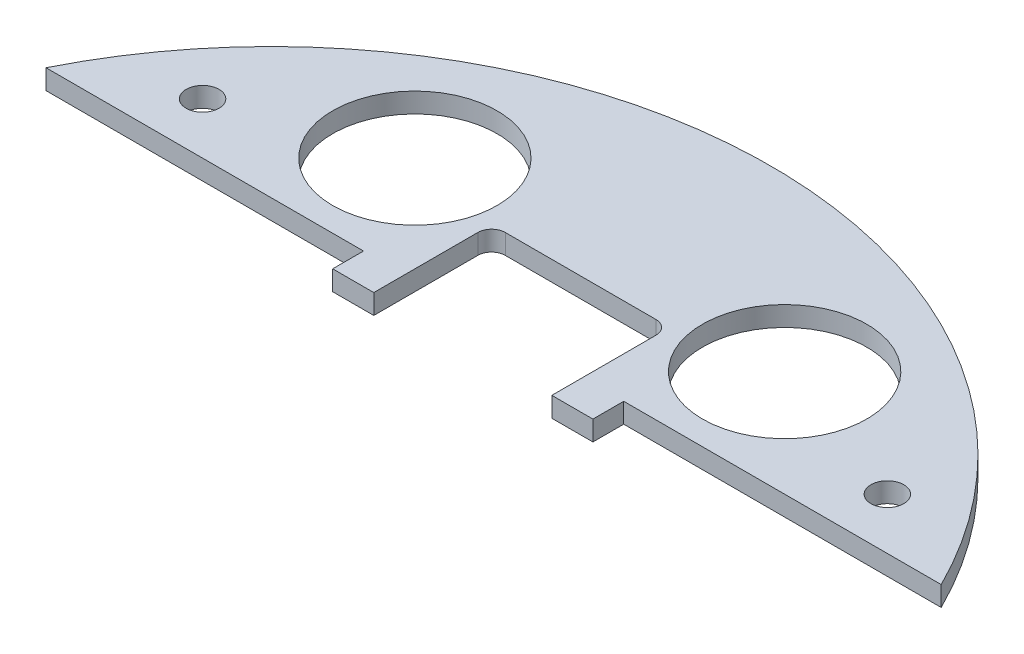
ISO-10303-21;
HEADER;
FILE_DESCRIPTION(('STEP AP214'),'2;1');
FILE_NAME('part.step','',(''),(''),'','','');
FILE_SCHEMA(('AUTOMOTIVE_DESIGN { 1 0 10303 214 1 1 1 1 }'));
ENDSEC;
DATA;
#1=APPLICATION_CONTEXT('core data for automotive mechanical design processes');
#2=APPLICATION_PROTOCOL_DEFINITION('international standard','automotive_design',2000,#1);
#3=PRODUCT_CONTEXT('',#1,'mechanical');
#4=PRODUCT('Part','Part','',(#3));
#5=PRODUCT_RELATED_PRODUCT_CATEGORY('part','',(#4));
#6=PRODUCT_DEFINITION_FORMATION('','',#4);
#7=PRODUCT_DEFINITION_CONTEXT('part definition',#1,'design');
#8=PRODUCT_DEFINITION('design','',#6,#7);
#9=PRODUCT_DEFINITION_SHAPE('','',#8);
#10=(LENGTH_UNIT() NAMED_UNIT(*) SI_UNIT(.MILLI.,.METRE.));
#11=(NAMED_UNIT(*) PLANE_ANGLE_UNIT() SI_UNIT($,.RADIAN.));
#12=(NAMED_UNIT(*) SI_UNIT($,.STERADIAN.) SOLID_ANGLE_UNIT());
#13=UNCERTAINTY_MEASURE_WITH_UNIT(LENGTH_MEASURE(1.E-05),#10,'distance_accuracy_value','');
#14=(GEOMETRIC_REPRESENTATION_CONTEXT(3) GLOBAL_UNCERTAINTY_ASSIGNED_CONTEXT((#13)) GLOBAL_UNIT_ASSIGNED_CONTEXT((#10,
#11,#12)) REPRESENTATION_CONTEXT('',''));
#15=CARTESIAN_POINT('',(0.,0.,0.));
#16=DIRECTION('',(0.,0.,1.));
#17=DIRECTION('',(1.,0.,0.));
#18=AXIS2_PLACEMENT_3D('',#15,#16,#17);
#19=CARTESIAN_POINT('',(-27.,0.,-48.));
#20=DIRECTION('',(0.,1.,0.));
#21=DIRECTION('',(0.,0.,1.));
#22=AXIS2_PLACEMENT_3D('',#19,#20,#21);
#23=CYLINDRICAL_SURFACE('',#22,12.);
#24=CARTESIAN_POINT('',(-27.,0.,-48.));
#25=DIRECTION('',(0.,1.,0.));
#26=DIRECTION('',(0.,0.,1.));
#27=AXIS2_PLACEMENT_3D('',#24,#25,#26);
#28=CIRCLE('',#27,12.);
#29=CARTESIAN_POINT('',(-27.,0.,-36.));
#30=VERTEX_POINT('',#29);
#31=EDGE_CURVE('E185',#30,#30,#28,.T.);
#32=ORIENTED_EDGE('',*,*,#31,.F.);
#33=EDGE_LOOP('',(#32));
#34=FACE_BOUND('',#33,.T.);
#35=CARTESIAN_POINT('',(-27.,2.9,-48.));
#36=DIRECTION('',(0.,1.,0.));
#37=DIRECTION('',(0.,0.,1.));
#38=AXIS2_PLACEMENT_3D('',#35,#36,#37);
#39=CIRCLE('',#38,12.);
#40=CARTESIAN_POINT('',(-27.,2.9,-36.));
#41=VERTEX_POINT('',#40);
#42=EDGE_CURVE('E182',#41,#41,#39,.T.);
#43=ORIENTED_EDGE('',*,*,#42,.T.);
#44=EDGE_LOOP('',(#43));
#45=FACE_BOUND('',#44,.T.);
#46=ADVANCED_FACE('F33',(#34,#45),#23,.F.);
#47=CARTESIAN_POINT('',(27.,0.,-48.));
#48=DIRECTION('',(0.,1.,0.));
#49=DIRECTION('',(0.,0.,1.));
#50=AXIS2_PLACEMENT_3D('',#47,#48,#49);
#51=CYLINDRICAL_SURFACE('',#50,12.);
#52=CARTESIAN_POINT('',(27.,0.,-48.));
#53=DIRECTION('',(0.,1.,0.));
#54=DIRECTION('',(0.,0.,1.));
#55=AXIS2_PLACEMENT_3D('',#52,#53,#54);
#56=CIRCLE('',#55,12.);
#57=CARTESIAN_POINT('',(27.,0.,-36.));
#58=VERTEX_POINT('',#57);
#59=EDGE_CURVE('E179',#58,#58,#56,.T.);
#60=ORIENTED_EDGE('',*,*,#59,.F.);
#61=EDGE_LOOP('',(#60));
#62=FACE_BOUND('',#61,.T.);
#63=CARTESIAN_POINT('',(27.,2.9,-48.));
#64=DIRECTION('',(0.,1.,0.));
#65=DIRECTION('',(0.,0.,1.));
#66=AXIS2_PLACEMENT_3D('',#63,#64,#65);
#67=CIRCLE('',#66,12.);
#68=CARTESIAN_POINT('',(27.,2.9,-36.));
#69=VERTEX_POINT('',#68);
#70=EDGE_CURVE('E170',#69,#69,#67,.T.);
#71=ORIENTED_EDGE('',*,*,#70,.T.);
#72=EDGE_LOOP('',(#71));
#73=FACE_BOUND('',#72,.T.);
#74=ADVANCED_FACE('F284',(#62,#73),#51,.F.);
#75=CARTESIAN_POINT('',(50.,0.,-40.));
#76=DIRECTION('',(0.,1.,0.));
#77=DIRECTION('',(0.,0.,1.));
#78=AXIS2_PLACEMENT_3D('',#75,#76,#77);
#79=CYLINDRICAL_SURFACE('',#78,2.4);
#80=CARTESIAN_POINT('',(50.,0.,-40.));
#81=DIRECTION('',(0.,1.,0.));
#82=DIRECTION('',(0.,0.,1.));
#83=AXIS2_PLACEMENT_3D('',#80,#81,#82);
#84=CIRCLE('',#83,2.4);
#85=CARTESIAN_POINT('',(50.,0.,-37.6));
#86=VERTEX_POINT('',#85);
#87=EDGE_CURVE('E174',#86,#86,#84,.T.);
#88=ORIENTED_EDGE('',*,*,#87,.F.);
#89=EDGE_LOOP('',(#88));
#90=FACE_BOUND('',#89,.T.);
#91=CARTESIAN_POINT('',(50.,2.9,-40.));
#92=DIRECTION('',(0.,1.,0.));
#93=DIRECTION('',(0.,0.,1.));
#94=AXIS2_PLACEMENT_3D('',#91,#92,#93);
#95=CIRCLE('',#94,2.4);
#96=CARTESIAN_POINT('',(50.,2.9,-37.6));
#97=VERTEX_POINT('',#96);
#98=EDGE_CURVE('E166',#97,#97,#95,.T.);
#99=ORIENTED_EDGE('',*,*,#98,.T.);
#100=EDGE_LOOP('',(#99));
#101=FACE_BOUND('',#100,.T.);
#102=ADVANCED_FACE('F290',(#90,#101),#79,.F.);
#103=CARTESIAN_POINT('',(-50.,0.,-40.));
#104=DIRECTION('',(0.,1.,0.));
#105=DIRECTION('',(0.,0.,1.));
#106=AXIS2_PLACEMENT_3D('',#103,#104,#105);
#107=CYLINDRICAL_SURFACE('',#106,2.4);
#108=CARTESIAN_POINT('',(-50.,0.,-40.));
#109=DIRECTION('',(0.,1.,0.));
#110=DIRECTION('',(0.,0.,1.));
#111=AXIS2_PLACEMENT_3D('',#108,#109,#110);
#112=CIRCLE('',#111,2.4);
#113=CARTESIAN_POINT('',(-50.,0.,-37.6));
#114=VERTEX_POINT('',#113);
#115=EDGE_CURVE('E167',#114,#114,#112,.T.);
#116=ORIENTED_EDGE('',*,*,#115,.F.);
#117=EDGE_LOOP('',(#116));
#118=FACE_BOUND('',#117,.T.);
#119=CARTESIAN_POINT('',(-50.,2.9,-40.));
#120=DIRECTION('',(0.,1.,0.));
#121=DIRECTION('',(0.,0.,1.));
#122=AXIS2_PLACEMENT_3D('',#119,#120,#121);
#123=CIRCLE('',#122,2.4);
#124=CARTESIAN_POINT('',(-50.,2.9,-37.6));
#125=VERTEX_POINT('',#124);
#126=EDGE_CURVE('E171',#125,#125,#123,.T.);
#127=ORIENTED_EDGE('',*,*,#126,.T.);
#128=EDGE_LOOP('',(#127));
#129=FACE_BOUND('',#128,.T.);
#130=ADVANCED_FACE('F299',(#118,#129),#107,.F.);
#131=CARTESIAN_POINT('',(-10.9999999999999,0.,-43.2));
#132=DIRECTION('',(0.,1.,0.));
#133=DIRECTION('',(0.,0.,1.));
#134=AXIS2_PLACEMENT_3D('',#131,#132,#133);
#135=CYLINDRICAL_SURFACE('',#134,2.);
#136=CARTESIAN_POINT('',(-10.9999999999999,2.9,-43.2));
#137=DIRECTION('',(0.,1.,0.));
#138=DIRECTION('',(0.,0.,1.));
#139=AXIS2_PLACEMENT_3D('',#136,#137,#138);
#140=CIRCLE('',#139,2.);
#141=CARTESIAN_POINT('',(-10.9999999999999,2.9,-45.2));
#142=VERTEX_POINT('',#141);
#143=CARTESIAN_POINT('',(-12.9999999999999,2.9,-43.2));
#144=VERTEX_POINT('',#143);
#145=EDGE_CURVE('E194',#142,#144,#140,.T.);
#146=ORIENTED_EDGE('',*,*,#145,.T.);
#147=DIRECTION('',(0.,1.,0.));
#148=VECTOR('',#147,1.);
#149=CARTESIAN_POINT('',(-12.9999999999999,0.,-43.2));
#150=LINE('',#149,#148);
#151=CARTESIAN_POINT('',(-12.9999999999999,0.,-43.2));
#152=VERTEX_POINT('',#151);
#153=EDGE_CURVE('E218',#152,#144,#150,.T.);
#154=ORIENTED_EDGE('',*,*,#153,.F.);
#155=CARTESIAN_POINT('',(-10.9999999999999,0.,-43.2));
#156=DIRECTION('',(0.,1.,0.));
#157=DIRECTION('',(0.,0.,1.));
#158=AXIS2_PLACEMENT_3D('',#155,#156,#157);
#159=CIRCLE('',#158,2.);
#160=CARTESIAN_POINT('',(-10.9999999999999,0.,-45.2));
#161=VERTEX_POINT('',#160);
#162=EDGE_CURVE('E202',#161,#152,#159,.T.);
#163=ORIENTED_EDGE('',*,*,#162,.F.);
#164=DIRECTION('',(0.,1.,0.));
#165=VECTOR('',#164,1.);
#166=CARTESIAN_POINT('',(-10.9999999999999,0.,-45.2));
#167=LINE('',#166,#165);
#168=EDGE_CURVE('E221',#161,#142,#167,.T.);
#169=ORIENTED_EDGE('',*,*,#168,.T.);
#170=EDGE_LOOP('',(#146,#154,#163,#169));
#171=FACE_BOUND('',#170,.T.);
#172=ADVANCED_FACE('F257',(#171),#135,.F.);
#173=CARTESIAN_POINT('',(10.9999999999999,0.,-45.2));
#174=DIRECTION('',(0.,0.,-1.));
#175=DIRECTION('',(-1.,0.,0.));
#176=AXIS2_PLACEMENT_3D('',#173,#174,#175);
#177=PLANE('',#176);
#178=DIRECTION('',(-1.,0.,0.));
#179=VECTOR('',#178,1.);
#180=CARTESIAN_POINT('',(10.9999999999999,2.9,-45.2));
#181=LINE('',#180,#179);
#182=CARTESIAN_POINT('',(10.9999999999999,2.9,-45.2));
#183=VERTEX_POINT('',#182);
#184=EDGE_CURVE('E213',#183,#142,#181,.T.);
#185=ORIENTED_EDGE('',*,*,#184,.T.);
#186=ORIENTED_EDGE('',*,*,#168,.F.);
#187=DIRECTION('',(-1.,0.,0.));
#188=VECTOR('',#187,1.);
#189=CARTESIAN_POINT('',(10.9999999999999,0.,-45.2));
#190=LINE('',#189,#188);
#191=CARTESIAN_POINT('',(10.9999999999999,0.,-45.2));
#192=VERTEX_POINT('',#191);
#193=EDGE_CURVE('E199',#192,#161,#190,.T.);
#194=ORIENTED_EDGE('',*,*,#193,.F.);
#195=DIRECTION('',(0.,1.,0.));
#196=VECTOR('',#195,1.);
#197=CARTESIAN_POINT('',(10.9999999999999,0.,-45.2));
#198=LINE('',#197,#196);
#199=EDGE_CURVE('E223',#192,#183,#198,.T.);
#200=ORIENTED_EDGE('',*,*,#199,.T.);
#201=EDGE_LOOP('',(#185,#186,#194,#200));
#202=FACE_BOUND('',#201,.T.);
#203=ADVANCED_FACE('F253',(#202),#177,.F.);
#204=CARTESIAN_POINT('',(10.9999999999999,0.,-43.2));
#205=DIRECTION('',(0.,1.,0.));
#206=DIRECTION('',(0.,0.,1.));
#207=AXIS2_PLACEMENT_3D('',#204,#205,#206);
#208=CYLINDRICAL_SURFACE('',#207,2.);
#209=CARTESIAN_POINT('',(10.9999999999999,2.9,-43.2));
#210=DIRECTION('',(0.,1.,0.));
#211=DIRECTION('',(0.,0.,-1.));
#212=AXIS2_PLACEMENT_3D('',#209,#210,#211);
#213=CIRCLE('',#212,2.);
#214=CARTESIAN_POINT('',(12.9999999999999,2.9,-43.2));
#215=VERTEX_POINT('',#214);
#216=EDGE_CURVE('E210',#215,#183,#213,.T.);
#217=ORIENTED_EDGE('',*,*,#216,.T.);
#218=ORIENTED_EDGE('',*,*,#199,.F.);
#219=CARTESIAN_POINT('',(10.9999999999999,0.,-43.2));
#220=DIRECTION('',(0.,1.,0.));
#221=DIRECTION('',(0.,0.,-1.));
#222=AXIS2_PLACEMENT_3D('',#219,#220,#221);
#223=CIRCLE('',#222,2.);
#224=CARTESIAN_POINT('',(12.9999999999999,0.,-43.2));
#225=VERTEX_POINT('',#224);
#226=EDGE_CURVE('E196',#225,#192,#223,.T.);
#227=ORIENTED_EDGE('',*,*,#226,.F.);
#228=DIRECTION('',(0.,1.,0.));
#229=VECTOR('',#228,1.);
#230=CARTESIAN_POINT('',(12.9999999999999,0.,-43.2));
#231=LINE('',#230,#229);
#232=EDGE_CURVE('E225',#225,#215,#231,.T.);
#233=ORIENTED_EDGE('',*,*,#232,.T.);
#234=EDGE_LOOP('',(#217,#218,#227,#233));
#235=FACE_BOUND('',#234,.T.);
#236=ADVANCED_FACE('F251',(#235),#208,.F.);
#237=CARTESIAN_POINT('',(-13.,0.,-28.));
#238=DIRECTION('',(-1.,0.,0.));
#239=DIRECTION('',(0.,0.,1.));
#240=AXIS2_PLACEMENT_3D('',#237,#238,#239);
#241=PLANE('',#240);
#242=DIRECTION('',(0.,0.,1.));
#243=VECTOR('',#242,1.);
#244=CARTESIAN_POINT('',(-13.,2.9,-28.));
#245=LINE('',#244,#243);
#246=CARTESIAN_POINT('',(-13.,2.9,-28.));
#247=VERTEX_POINT('',#246);
#248=EDGE_CURVE('E188',#144,#247,#245,.T.);
#249=ORIENTED_EDGE('',*,*,#248,.T.);
#250=DIRECTION('',(0.,1.,0.));
#251=VECTOR('',#250,1.);
#252=CARTESIAN_POINT('',(-13.,0.,-28.));
#253=LINE('',#252,#251);
#254=CARTESIAN_POINT('',(-13.,0.,-28.));
#255=VERTEX_POINT('',#254);
#256=EDGE_CURVE('E205',#255,#247,#253,.T.);
#257=ORIENTED_EDGE('',*,*,#256,.F.);
#258=DIRECTION('',(0.,0.,1.));
#259=VECTOR('',#258,1.);
#260=CARTESIAN_POINT('',(-13.,0.,-28.));
#261=LINE('',#260,#259);
#262=EDGE_CURVE('E191',#152,#255,#261,.T.);
#263=ORIENTED_EDGE('',*,*,#262,.F.);
#264=ORIENTED_EDGE('',*,*,#153,.T.);
#265=EDGE_LOOP('',(#249,#257,#263,#264));
#266=FACE_BOUND('',#265,.T.);
#267=ADVANCED_FACE('F304',(#266),#241,.F.);
#268=CARTESIAN_POINT('',(13.,0.,-28.));
#269=DIRECTION('',(1.,0.,0.));
#270=DIRECTION('',(0.,0.,-1.));
#271=AXIS2_PLACEMENT_3D('',#268,#269,#270);
#272=PLANE('',#271);
#273=DIRECTION('',(0.,0.,-1.));
#274=VECTOR('',#273,1.);
#275=CARTESIAN_POINT('',(13.,2.9,-28.));
#276=LINE('',#275,#274);
#277=CARTESIAN_POINT('',(13.,2.9,-28.));
#278=VERTEX_POINT('',#277);
#279=EDGE_CURVE('E207',#278,#215,#276,.T.);
#280=ORIENTED_EDGE('',*,*,#279,.T.);
#281=ORIENTED_EDGE('',*,*,#232,.F.);
#282=DIRECTION('',(0.,0.,-1.));
#283=VECTOR('',#282,1.);
#284=CARTESIAN_POINT('',(13.,0.,-28.));
#285=LINE('',#284,#283);
#286=CARTESIAN_POINT('',(13.,0.,-28.));
#287=VERTEX_POINT('',#286);
#288=EDGE_CURVE('E48',#287,#225,#285,.T.);
#289=ORIENTED_EDGE('',*,*,#288,.F.);
#290=DIRECTION('',(0.,1.,0.));
#291=VECTOR('',#290,1.);
#292=CARTESIAN_POINT('',(13.,0.,-28.));
#293=LINE('',#292,#291);
#294=EDGE_CURVE('E227',#287,#278,#293,.T.);
#295=ORIENTED_EDGE('',*,*,#294,.T.);
#296=EDGE_LOOP('',(#280,#281,#289,#295));
#297=FACE_BOUND('',#296,.T.);
#298=ADVANCED_FACE('F247',(#297),#272,.F.);
#299=CARTESIAN_POINT('',(19.,0.,-28.));
#300=DIRECTION('',(0.,0.,-1.));
#301=DIRECTION('',(-1.,0.,0.));
#302=AXIS2_PLACEMENT_3D('',#299,#300,#301);
#303=PLANE('',#302);
#304=DIRECTION('',(-1.,0.,0.));
#305=VECTOR('',#304,1.);
#306=CARTESIAN_POINT('',(19.,0.,-28.));
#307=LINE('',#306,#305);
#308=CARTESIAN_POINT('',(-19.,0.,-28.));
#309=VERTEX_POINT('',#308);
#310=EDGE_CURVE('E233',#255,#309,#307,.T.);
#311=ORIENTED_EDGE('',*,*,#310,.F.);
#312=ORIENTED_EDGE('',*,*,#256,.T.);
#313=DIRECTION('',(-1.,0.,0.));
#314=VECTOR('',#313,1.);
#315=CARTESIAN_POINT('',(19.,2.9,-28.));
#316=LINE('',#315,#314);
#317=CARTESIAN_POINT('',(-19.,2.9,-28.));
#318=VERTEX_POINT('',#317);
#319=EDGE_CURVE('E220',#247,#318,#316,.T.);
#320=ORIENTED_EDGE('',*,*,#319,.T.);
#321=DIRECTION('',(0.,1.,0.));
#322=VECTOR('',#321,1.);
#323=CARTESIAN_POINT('',(-19.,0.,-28.));
#324=LINE('',#323,#322);
#325=EDGE_CURVE('E237',#309,#318,#324,.T.);
#326=ORIENTED_EDGE('',*,*,#325,.F.);
#327=EDGE_LOOP('',(#311,#312,#320,#326));
#328=FACE_BOUND('',#327,.T.);
#329=ADVANCED_FACE('F263',(#328),#303,.F.);
#330=CARTESIAN_POINT('',(19.,2.9,-28.));
#331=VERTEX_POINT('',#330);
#332=EDGE_CURVE('E234',#331,#278,#316,.T.);
#333=ORIENTED_EDGE('',*,*,#332,.T.);
#334=ORIENTED_EDGE('',*,*,#294,.F.);
#335=CARTESIAN_POINT('',(19.,0.,-28.));
#336=VERTEX_POINT('',#335);
#337=EDGE_CURVE('E231',#336,#287,#307,.T.);
#338=ORIENTED_EDGE('',*,*,#337,.F.);
#339=DIRECTION('',(0.,1.,0.));
#340=VECTOR('',#339,1.);
#341=CARTESIAN_POINT('',(19.,0.,-28.));
#342=LINE('',#341,#340);
#343=EDGE_CURVE('E138',#336,#331,#342,.T.);
#344=ORIENTED_EDGE('',*,*,#343,.T.);
#345=EDGE_LOOP('',(#333,#334,#338,#344));
#346=FACE_BOUND('',#345,.T.);
#347=ADVANCED_FACE('F241',(#346),#303,.F.);
#348=CARTESIAN_POINT('',(17.1660889906091,0.,71.8483455882353));
#349=DIRECTION('',(0.,-1.,0.));
#350=DIRECTION('',(0.,0.,-1.));
#351=AXIS2_PLACEMENT_3D('',#348,#349,#350);
#352=PLANE('',#351);
#353=DIRECTION('',(-1.,0.,0.));
#354=VECTOR('',#353,1.);
#355=CARTESIAN_POINT('',(-73.,0.,-32.5));
#356=LINE('',#355,#354);
#357=CARTESIAN_POINT('',(-19.,0.,-32.5));
#358=VERTEX_POINT('',#357);
#359=CARTESIAN_POINT('',(-65.3662757085028,0.,-32.5));
#360=VERTEX_POINT('',#359);
#361=EDGE_CURVE('E132',#358,#360,#356,.T.);
#362=ORIENTED_EDGE('',*,*,#361,.T.);
#363=CARTESIAN_POINT('',(0.,0.,0.));
#364=DIRECTION('',(0.,1.,0.));
#365=DIRECTION('',(0.,0.,1.));
#366=AXIS2_PLACEMENT_3D('',#363,#364,#365);
#367=CIRCLE('',#366,73.);
#368=CARTESIAN_POINT('',(65.3662757085028,0.,-32.5));
#369=VERTEX_POINT('',#368);
#370=EDGE_CURVE('E37',#369,#360,#367,.T.);
#371=ORIENTED_EDGE('',*,*,#370,.F.);
#372=DIRECTION('',(-1.,0.,0.));
#373=VECTOR('',#372,1.);
#374=CARTESIAN_POINT('',(19.,0.,-32.5));
#375=LINE('',#374,#373);
#376=CARTESIAN_POINT('',(19.,0.,-32.5));
#377=VERTEX_POINT('',#376);
#378=EDGE_CURVE('E125',#369,#377,#375,.T.);
#379=ORIENTED_EDGE('',*,*,#378,.T.);
#380=DIRECTION('',(0.,0.,1.));
#381=VECTOR('',#380,1.);
#382=CARTESIAN_POINT('',(19.,0.,-28.));
#383=LINE('',#382,#381);
#384=EDGE_CURVE('E135',#377,#336,#383,.T.);
#385=ORIENTED_EDGE('',*,*,#384,.T.);
#386=ORIENTED_EDGE('',*,*,#337,.T.);
#387=ORIENTED_EDGE('',*,*,#288,.T.);
#388=ORIENTED_EDGE('',*,*,#226,.T.);
#389=ORIENTED_EDGE('',*,*,#193,.T.);
#390=ORIENTED_EDGE('',*,*,#162,.T.);
#391=ORIENTED_EDGE('',*,*,#262,.T.);
#392=ORIENTED_EDGE('',*,*,#310,.T.);
#393=DIRECTION('',(0.,0.,-1.));
#394=VECTOR('',#393,1.);
#395=CARTESIAN_POINT('',(-19.,0.,-28.));
#396=LINE('',#395,#394);
#397=EDGE_CURVE('E57',#309,#358,#396,.T.);
#398=ORIENTED_EDGE('',*,*,#397,.T.);
#399=EDGE_LOOP('',(#362,#371,#379,#385,#386,#387,#388,#389,#390,#391,#392,#398));
#400=FACE_BOUND('',#399,.T.);
#401=ORIENTED_EDGE('',*,*,#115,.T.);
#402=EDGE_LOOP('',(#401));
#403=FACE_BOUND('',#402,.T.);
#404=ORIENTED_EDGE('',*,*,#87,.T.);
#405=EDGE_LOOP('',(#404));
#406=FACE_BOUND('',#405,.T.);
#407=ORIENTED_EDGE('',*,*,#59,.T.);
#408=EDGE_LOOP('',(#407));
#409=FACE_BOUND('',#408,.T.);
#410=ORIENTED_EDGE('',*,*,#31,.T.);
#411=EDGE_LOOP('',(#410));
#412=FACE_BOUND('',#411,.T.);
#413=ADVANCED_FACE('F145',(#400,#403,#406,#409,#412),#352,.T.);
#414=CARTESIAN_POINT('',(17.1660889906091,2.9,71.8483455882353));
#415=DIRECTION('',(0.,-1.,0.));
#416=DIRECTION('',(0.,0.,-1.));
#417=AXIS2_PLACEMENT_3D('',#414,#415,#416);
#418=PLANE('',#417);
#419=ORIENTED_EDGE('',*,*,#126,.F.);
#420=EDGE_LOOP('',(#419));
#421=FACE_BOUND('',#420,.T.);
#422=ORIENTED_EDGE('',*,*,#98,.F.);
#423=EDGE_LOOP('',(#422));
#424=FACE_BOUND('',#423,.T.);
#425=ORIENTED_EDGE('',*,*,#70,.F.);
#426=EDGE_LOOP('',(#425));
#427=FACE_BOUND('',#426,.T.);
#428=ORIENTED_EDGE('',*,*,#42,.F.);
#429=EDGE_LOOP('',(#428));
#430=FACE_BOUND('',#429,.T.);
#431=CARTESIAN_POINT('',(0.,2.9,0.));
#432=DIRECTION('',(0.,1.,0.));
#433=DIRECTION('',(0.,0.,1.));
#434=AXIS2_PLACEMENT_3D('',#431,#432,#433);
#435=CIRCLE('',#434,73.);
#436=CARTESIAN_POINT('',(65.3662757085028,2.9,-32.5));
#437=VERTEX_POINT('',#436);
#438=CARTESIAN_POINT('',(-65.3662757085028,2.9,-32.5));
#439=VERTEX_POINT('',#438);
#440=EDGE_CURVE('E11',#437,#439,#435,.T.);
#441=ORIENTED_EDGE('',*,*,#440,.T.);
#442=DIRECTION('',(-1.,0.,0.));
#443=VECTOR('',#442,1.);
#444=CARTESIAN_POINT('',(-73.,2.9,-32.5));
#445=LINE('',#444,#443);
#446=CARTESIAN_POINT('',(-19.,2.9,-32.5));
#447=VERTEX_POINT('',#446);
#448=EDGE_CURVE('E148',#447,#439,#445,.T.);
#449=ORIENTED_EDGE('',*,*,#448,.F.);
#450=DIRECTION('',(0.,0.,-1.));
#451=VECTOR('',#450,1.);
#452=CARTESIAN_POINT('',(-19.,2.9,-28.));
#453=LINE('',#452,#451);
#454=EDGE_CURVE('E150',#318,#447,#453,.T.);
#455=ORIENTED_EDGE('',*,*,#454,.F.);
#456=ORIENTED_EDGE('',*,*,#319,.F.);
#457=ORIENTED_EDGE('',*,*,#248,.F.);
#458=ORIENTED_EDGE('',*,*,#145,.F.);
#459=ORIENTED_EDGE('',*,*,#184,.F.);
#460=ORIENTED_EDGE('',*,*,#216,.F.);
#461=ORIENTED_EDGE('',*,*,#279,.F.);
#462=ORIENTED_EDGE('',*,*,#332,.F.);
#463=DIRECTION('',(0.,0.,1.));
#464=VECTOR('',#463,1.);
#465=CARTESIAN_POINT('',(19.,2.9,-28.));
#466=LINE('',#465,#464);
#467=CARTESIAN_POINT('',(19.,2.9,-32.5));
#468=VERTEX_POINT('',#467);
#469=EDGE_CURVE('E156',#468,#331,#466,.T.);
#470=ORIENTED_EDGE('',*,*,#469,.F.);
#471=DIRECTION('',(-1.,0.,0.));
#472=VECTOR('',#471,1.);
#473=CARTESIAN_POINT('',(19.,2.9,-32.5));
#474=LINE('',#473,#472);
#475=EDGE_CURVE('E128',#437,#468,#474,.T.);
#476=ORIENTED_EDGE('',*,*,#475,.F.);
#477=EDGE_LOOP('',(#441,#449,#455,#456,#457,#458,#459,#460,#461,#462,#470,#476));
#478=FACE_BOUND('',#477,.T.);
#479=ADVANCED_FACE('F244',(#421,#424,#427,#430,#478),#418,.F.);
#480=CARTESIAN_POINT('',(0.,2.9,0.));
#481=DIRECTION('',(0.,-1.,0.));
#482=DIRECTION('',(0.,0.,-1.));
#483=AXIS2_PLACEMENT_3D('',#480,#481,#482);
#484=CYLINDRICAL_SURFACE('',#483,73.);
#485=ORIENTED_EDGE('',*,*,#440,.F.);
#486=DIRECTION('',(0.,-1.,0.));
#487=VECTOR('',#486,1.);
#488=CARTESIAN_POINT('',(65.3662757085028,2.9,-32.5));
#489=LINE('',#488,#487);
#490=EDGE_CURVE('E164',#437,#369,#489,.T.);
#491=ORIENTED_EDGE('',*,*,#490,.T.);
#492=ORIENTED_EDGE('',*,*,#370,.T.);
#493=DIRECTION('',(0.,-1.,0.));
#494=VECTOR('',#493,1.);
#495=CARTESIAN_POINT('',(-65.3662757085028,2.9,-32.5));
#496=LINE('',#495,#494);
#497=EDGE_CURVE('E160',#360,#439,#496,.F.);
#498=ORIENTED_EDGE('',*,*,#497,.T.);
#499=EDGE_LOOP('',(#485,#491,#492,#498));
#500=FACE_BOUND('',#499,.T.);
#501=ADVANCED_FACE('F35',(#500),#484,.T.);
#502=CARTESIAN_POINT('',(19.,0.,-28.));
#503=DIRECTION('',(-1.,0.,0.));
#504=DIRECTION('',(0.,0.,1.));
#505=AXIS2_PLACEMENT_3D('',#502,#503,#504);
#506=PLANE('',#505);
#507=ORIENTED_EDGE('',*,*,#469,.T.);
#508=ORIENTED_EDGE('',*,*,#343,.F.);
#509=ORIENTED_EDGE('',*,*,#384,.F.);
#510=DIRECTION('',(0.,1.,0.));
#511=VECTOR('',#510,1.);
#512=CARTESIAN_POINT('',(19.,0.,-32.5));
#513=LINE('',#512,#511);
#514=EDGE_CURVE('E121',#377,#468,#513,.T.);
#515=ORIENTED_EDGE('',*,*,#514,.T.);
#516=EDGE_LOOP('',(#507,#508,#509,#515));
#517=FACE_BOUND('',#516,.T.);
#518=ADVANCED_FACE('F136',(#517),#506,.F.);
#519=CARTESIAN_POINT('',(19.,0.,-32.5));
#520=DIRECTION('',(0.,0.,-1.));
#521=DIRECTION('',(-1.,0.,0.));
#522=AXIS2_PLACEMENT_3D('',#519,#520,#521);
#523=PLANE('',#522);
#524=ORIENTED_EDGE('',*,*,#475,.T.);
#525=ORIENTED_EDGE('',*,*,#514,.F.);
#526=ORIENTED_EDGE('',*,*,#378,.F.);
#527=ORIENTED_EDGE('',*,*,#490,.F.);
#528=EDGE_LOOP('',(#524,#525,#526,#527));
#529=FACE_BOUND('',#528,.T.);
#530=ADVANCED_FACE('F123',(#529),#523,.F.);
#531=CARTESIAN_POINT('',(-19.,0.,-28.));
#532=DIRECTION('',(1.,0.,0.));
#533=DIRECTION('',(0.,0.,-1.));
#534=AXIS2_PLACEMENT_3D('',#531,#532,#533);
#535=PLANE('',#534);
#536=ORIENTED_EDGE('',*,*,#454,.T.);
#537=DIRECTION('',(0.,1.,0.));
#538=VECTOR('',#537,1.);
#539=CARTESIAN_POINT('',(-19.,0.,-32.5));
#540=LINE('',#539,#538);
#541=EDGE_CURVE('E131',#358,#447,#540,.T.);
#542=ORIENTED_EDGE('',*,*,#541,.F.);
#543=ORIENTED_EDGE('',*,*,#397,.F.);
#544=ORIENTED_EDGE('',*,*,#325,.T.);
#545=EDGE_LOOP('',(#536,#542,#543,#544));
#546=FACE_BOUND('',#545,.T.);
#547=ADVANCED_FACE('F267',(#546),#535,.F.);
#548=CARTESIAN_POINT('',(-73.,0.,-32.5));
#549=DIRECTION('',(0.,0.,-1.));
#550=DIRECTION('',(-1.,0.,0.));
#551=AXIS2_PLACEMENT_3D('',#548,#549,#550);
#552=PLANE('',#551);
#553=ORIENTED_EDGE('',*,*,#361,.F.);
#554=ORIENTED_EDGE('',*,*,#541,.T.);
#555=ORIENTED_EDGE('',*,*,#448,.T.);
#556=ORIENTED_EDGE('',*,*,#497,.F.);
#557=EDGE_LOOP('',(#553,#554,#555,#556));
#558=FACE_BOUND('',#557,.T.);
#559=ADVANCED_FACE('F273',(#558),#552,.F.);
#560=CLOSED_SHELL('',(#46,#74,#102,#130,#172,#203,#236,#267,#298,#329,#347,#413,#479,#501,#518,
#530,#547,#559));
#561=MANIFOLD_SOLID_BREP('B2',#560);
#562=ADVANCED_BREP_SHAPE_REPRESENTATION('',(#18,#561),#14);
#563=SHAPE_DEFINITION_REPRESENTATION(#9,#562);
ENDSEC;
END-ISO-10303-21;
